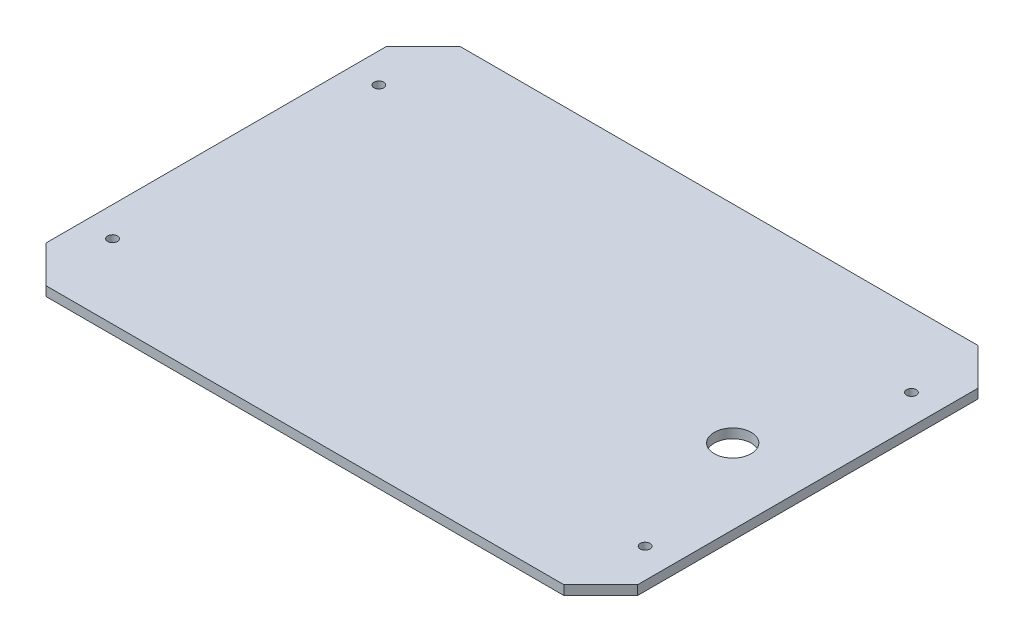
ISO-10303-21;
HEADER;
FILE_DESCRIPTION(('STEP AP214'),'2;1');
FILE_NAME('part.step','',(''),(''),'','','');
FILE_SCHEMA(('AUTOMOTIVE_DESIGN { 1 0 10303 214 1 1 1 1 }'));
ENDSEC;
DATA;
#1=APPLICATION_CONTEXT('core data for automotive mechanical design processes');
#2=APPLICATION_PROTOCOL_DEFINITION('international standard','automotive_design',2000,#1);
#3=PRODUCT_CONTEXT('',#1,'mechanical');
#4=PRODUCT('Part','Part','',(#3));
#5=PRODUCT_RELATED_PRODUCT_CATEGORY('part','',(#4));
#6=PRODUCT_DEFINITION_FORMATION('','',#4);
#7=PRODUCT_DEFINITION_CONTEXT('part definition',#1,'design');
#8=PRODUCT_DEFINITION('design','',#6,#7);
#9=PRODUCT_DEFINITION_SHAPE('','',#8);
#10=(LENGTH_UNIT() NAMED_UNIT(*) SI_UNIT(.MILLI.,.METRE.));
#11=(NAMED_UNIT(*) PLANE_ANGLE_UNIT() SI_UNIT($,.RADIAN.));
#12=(NAMED_UNIT(*) SI_UNIT($,.STERADIAN.) SOLID_ANGLE_UNIT());
#13=UNCERTAINTY_MEASURE_WITH_UNIT(LENGTH_MEASURE(1.E-05),#10,'distance_accuracy_value','');
#14=(GEOMETRIC_REPRESENTATION_CONTEXT(3) GLOBAL_UNCERTAINTY_ASSIGNED_CONTEXT((#13)) GLOBAL_UNIT_ASSIGNED_CONTEXT((#10,
#11,#12)) REPRESENTATION_CONTEXT('',''));
#15=CARTESIAN_POINT('',(0.,0.,0.));
#16=DIRECTION('',(0.,0.,1.));
#17=DIRECTION('',(1.,0.,0.));
#18=AXIS2_PLACEMENT_3D('',#15,#16,#17);
#19=CARTESIAN_POINT('',(0.,6.35,0.));
#20=DIRECTION('',(0.,-1.,0.));
#21=DIRECTION('',(0.,0.,-1.));
#22=AXIS2_PLACEMENT_3D('',#19,#20,#21);
#23=PLANE('',#22);
#24=CARTESIAN_POINT('',(380.,6.35,-230.));
#25=DIRECTION('',(0.,1.,0.));
#26=DIRECTION('',(0.,0.,1.));
#27=AXIS2_PLACEMENT_3D('',#24,#25,#26);
#28=CIRCLE('',#27,3.29999999999997);
#29=CARTESIAN_POINT('',(380.,6.35,-226.7));
#30=VERTEX_POINT('',#29);
#31=EDGE_CURVE('E202',#30,#30,#28,.T.);
#32=ORIENTED_EDGE('',*,*,#31,.F.);
#33=EDGE_LOOP('',(#32));
#34=FACE_BOUND('',#33,.T.);
#35=CARTESIAN_POINT('',(380.,6.35,-50.));
#36=DIRECTION('',(0.,1.,0.));
#37=DIRECTION('',(0.,0.,1.));
#38=AXIS2_PLACEMENT_3D('',#35,#36,#37);
#39=CIRCLE('',#38,3.29999999999997);
#40=CARTESIAN_POINT('',(380.,6.35,-46.7));
#41=VERTEX_POINT('',#40);
#42=EDGE_CURVE('E196',#41,#41,#39,.T.);
#43=ORIENTED_EDGE('',*,*,#42,.F.);
#44=EDGE_LOOP('',(#43));
#45=FACE_BOUND('',#44,.T.);
#46=CARTESIAN_POINT('',(20.,6.35,-230.));
#47=DIRECTION('',(0.,1.,0.));
#48=DIRECTION('',(0.,0.,1.));
#49=AXIS2_PLACEMENT_3D('',#46,#47,#48);
#50=CIRCLE('',#49,3.3);
#51=CARTESIAN_POINT('',(20.,6.35,-226.7));
#52=VERTEX_POINT('',#51);
#53=EDGE_CURVE('E184',#52,#52,#50,.T.);
#54=ORIENTED_EDGE('',*,*,#53,.F.);
#55=EDGE_LOOP('',(#54));
#56=FACE_BOUND('',#55,.T.);
#57=CARTESIAN_POINT('',(349.2,6.35,-140.));
#58=DIRECTION('',(0.,1.,0.));
#59=DIRECTION('',(0.,0.,1.));
#60=AXIS2_PLACEMENT_3D('',#57,#58,#59);
#61=CIRCLE('',#60,12.5);
#62=CARTESIAN_POINT('',(349.2,6.35,-127.5));
#63=VERTEX_POINT('',#62);
#64=EDGE_CURVE('E176',#63,#63,#61,.T.);
#65=ORIENTED_EDGE('',*,*,#64,.F.);
#66=EDGE_LOOP('',(#65));
#67=FACE_BOUND('',#66,.T.);
#68=DIRECTION('',(0.,0.,1.));
#69=VECTOR('',#68,1.);
#70=CARTESIAN_POINT('',(0.,6.35,0.));
#71=LINE('',#70,#69);
#72=CARTESIAN_POINT('',(0.,6.35,-255.));
#73=VERTEX_POINT('',#72);
#74=CARTESIAN_POINT('',(0.,6.35,-25.0000000000002));
#75=VERTEX_POINT('',#74);
#76=EDGE_CURVE('E136',#73,#75,#71,.T.);
#77=ORIENTED_EDGE('',*,*,#76,.T.);
#78=DIRECTION('',(-0.707106781186546,0.,-0.707106781186549));
#79=VECTOR('',#78,1.);
#80=CARTESIAN_POINT('',(25.0000000000001,6.35,0.));
#81=LINE('',#80,#79);
#82=CARTESIAN_POINT('',(25.0000000000001,6.35,0.));
#83=VERTEX_POINT('',#82);
#84=EDGE_CURVE('E151',#75,#83,#81,.F.);
#85=ORIENTED_EDGE('',*,*,#84,.T.);
#86=DIRECTION('',(1.,0.,0.));
#87=VECTOR('',#86,1.);
#88=CARTESIAN_POINT('',(0.,6.35,0.));
#89=LINE('',#88,#87);
#90=CARTESIAN_POINT('',(375.,6.35,0.));
#91=VERTEX_POINT('',#90);
#92=EDGE_CURVE('E119',#83,#91,#89,.T.);
#93=ORIENTED_EDGE('',*,*,#92,.T.);
#94=DIRECTION('',(-0.707106781186549,0.,0.707106781186546));
#95=VECTOR('',#94,1.);
#96=CARTESIAN_POINT('',(400.,6.35,-25.0000000000001));
#97=LINE('',#96,#95);
#98=CARTESIAN_POINT('',(400.,6.35,-25.0000000000001));
#99=VERTEX_POINT('',#98);
#100=EDGE_CURVE('E146',#91,#99,#97,.F.);
#101=ORIENTED_EDGE('',*,*,#100,.T.);
#102=DIRECTION('',(0.,0.,-1.));
#103=VECTOR('',#102,1.);
#104=CARTESIAN_POINT('',(400.,6.35,0.));
#105=LINE('',#104,#103);
#106=CARTESIAN_POINT('',(400.,6.35,-255.));
#107=VERTEX_POINT('',#106);
#108=EDGE_CURVE('E162',#99,#107,#105,.T.);
#109=ORIENTED_EDGE('',*,*,#108,.T.);
#110=DIRECTION('',(0.707106781186546,0.,0.707106781186549));
#111=VECTOR('',#110,1.);
#112=CARTESIAN_POINT('',(375.,6.35,-280.));
#113=LINE('',#112,#111);
#114=CARTESIAN_POINT('',(375.,6.35,-280.));
#115=VERTEX_POINT('',#114);
#116=EDGE_CURVE('E55',#107,#115,#113,.F.);
#117=ORIENTED_EDGE('',*,*,#116,.T.);
#118=DIRECTION('',(-1.,0.,0.));
#119=VECTOR('',#118,1.);
#120=CARTESIAN_POINT('',(0.,6.35,-280.));
#121=LINE('',#120,#119);
#122=CARTESIAN_POINT('',(25.,6.35,-280.));
#123=VERTEX_POINT('',#122);
#124=EDGE_CURVE('E137',#115,#123,#121,.T.);
#125=ORIENTED_EDGE('',*,*,#124,.T.);
#126=DIRECTION('',(0.707106781186548,0.,-0.707106781186547));
#127=VECTOR('',#126,1.);
#128=CARTESIAN_POINT('',(0.,6.35,-255.));
#129=LINE('',#128,#127);
#130=EDGE_CURVE('E149',#123,#73,#129,.F.);
#131=ORIENTED_EDGE('',*,*,#130,.T.);
#132=EDGE_LOOP('',(#77,#85,#93,#101,#109,#117,#125,#131));
#133=FACE_BOUND('',#132,.T.);
#134=CARTESIAN_POINT('',(20.,6.35,-50.));
#135=DIRECTION('',(0.,1.,0.));
#136=DIRECTION('',(0.,0.,1.));
#137=AXIS2_PLACEMENT_3D('',#134,#135,#136);
#138=CIRCLE('',#137,3.3);
#139=CARTESIAN_POINT('',(20.,6.35,-46.7));
#140=VERTEX_POINT('',#139);
#141=EDGE_CURVE('E190',#140,#140,#138,.T.);
#142=ORIENTED_EDGE('',*,*,#141,.F.);
#143=EDGE_LOOP('',(#142));
#144=FACE_BOUND('',#143,.T.);
#145=ADVANCED_FACE('F33',(#34,#45,#56,#67,#133,#144),#23,.F.);
#146=CARTESIAN_POINT('',(0.,6.35,0.));
#147=DIRECTION('',(1.,0.,0.));
#148=DIRECTION('',(0.,0.,-1.));
#149=AXIS2_PLACEMENT_3D('',#146,#147,#148);
#150=PLANE('',#149);
#151=DIRECTION('',(0.,0.,1.));
#152=VECTOR('',#151,1.);
#153=CARTESIAN_POINT('',(0.,0.,0.));
#154=LINE('',#153,#152);
#155=CARTESIAN_POINT('',(0.,0.,-255.));
#156=VERTEX_POINT('',#155);
#157=CARTESIAN_POINT('',(0.,0.,-25.0000000000002));
#158=VERTEX_POINT('',#157);
#159=EDGE_CURVE('E126',#156,#158,#154,.T.);
#160=ORIENTED_EDGE('',*,*,#159,.T.);
#161=DIRECTION('',(0.,1.,0.));
#162=VECTOR('',#161,1.);
#163=CARTESIAN_POINT('',(0.,6.35,-25.0000000000002));
#164=LINE('',#163,#162);
#165=EDGE_CURVE('E104',#158,#75,#164,.T.);
#166=ORIENTED_EDGE('',*,*,#165,.T.);
#167=ORIENTED_EDGE('',*,*,#76,.F.);
#168=DIRECTION('',(0.,-1.,0.));
#169=VECTOR('',#168,1.);
#170=CARTESIAN_POINT('',(0.,6.35,-255.));
#171=LINE('',#170,#169);
#172=EDGE_CURVE('E109',#73,#156,#171,.T.);
#173=ORIENTED_EDGE('',*,*,#172,.T.);
#174=EDGE_LOOP('',(#160,#166,#167,#173));
#175=FACE_BOUND('',#174,.T.);
#176=ADVANCED_FACE('F210',(#175),#150,.F.);
#177=CARTESIAN_POINT('',(0.,6.35,0.));
#178=DIRECTION('',(0.,0.,-1.));
#179=DIRECTION('',(-1.,0.,0.));
#180=AXIS2_PLACEMENT_3D('',#177,#178,#179);
#181=PLANE('',#180);
#182=ORIENTED_EDGE('',*,*,#92,.F.);
#183=DIRECTION('',(0.,-1.,0.));
#184=VECTOR('',#183,1.);
#185=CARTESIAN_POINT('',(25.0000000000001,6.35,0.));
#186=LINE('',#185,#184);
#187=CARTESIAN_POINT('',(25.0000000000001,0.,0.));
#188=VERTEX_POINT('',#187);
#189=EDGE_CURVE('E103',#83,#188,#186,.T.);
#190=ORIENTED_EDGE('',*,*,#189,.T.);
#191=DIRECTION('',(1.,0.,0.));
#192=VECTOR('',#191,1.);
#193=CARTESIAN_POINT('',(0.,0.,0.));
#194=LINE('',#193,#192);
#195=CARTESIAN_POINT('',(375.,0.,0.));
#196=VERTEX_POINT('',#195);
#197=EDGE_CURVE('E116',#188,#196,#194,.T.);
#198=ORIENTED_EDGE('',*,*,#197,.T.);
#199=DIRECTION('',(0.,1.,0.));
#200=VECTOR('',#199,1.);
#201=CARTESIAN_POINT('',(375.,6.35,0.));
#202=LINE('',#201,#200);
#203=EDGE_CURVE('E121',#196,#91,#202,.T.);
#204=ORIENTED_EDGE('',*,*,#203,.T.);
#205=EDGE_LOOP('',(#182,#190,#198,#204));
#206=FACE_BOUND('',#205,.T.);
#207=ADVANCED_FACE('F115',(#206),#181,.F.);
#208=CARTESIAN_POINT('',(400.,6.35,0.));
#209=DIRECTION('',(-1.,0.,0.));
#210=DIRECTION('',(0.,0.,1.));
#211=AXIS2_PLACEMENT_3D('',#208,#209,#210);
#212=PLANE('',#211);
#213=DIRECTION('',(0.,0.,-1.));
#214=VECTOR('',#213,1.);
#215=CARTESIAN_POINT('',(400.,0.,0.));
#216=LINE('',#215,#214);
#217=CARTESIAN_POINT('',(400.,0.,-25.0000000000001));
#218=VERTEX_POINT('',#217);
#219=CARTESIAN_POINT('',(400.,0.,-255.));
#220=VERTEX_POINT('',#219);
#221=EDGE_CURVE('E125',#218,#220,#216,.T.);
#222=ORIENTED_EDGE('',*,*,#221,.T.);
#223=DIRECTION('',(0.,1.,0.));
#224=VECTOR('',#223,1.);
#225=CARTESIAN_POINT('',(400.,6.35,-255.));
#226=LINE('',#225,#224);
#227=EDGE_CURVE('E11',#220,#107,#226,.T.);
#228=ORIENTED_EDGE('',*,*,#227,.T.);
#229=ORIENTED_EDGE('',*,*,#108,.F.);
#230=DIRECTION('',(0.,-1.,0.));
#231=VECTOR('',#230,1.);
#232=CARTESIAN_POINT('',(400.,6.35,-25.0000000000001));
#233=LINE('',#232,#231);
#234=EDGE_CURVE('E41',#99,#218,#233,.T.);
#235=ORIENTED_EDGE('',*,*,#234,.T.);
#236=EDGE_LOOP('',(#222,#228,#229,#235));
#237=FACE_BOUND('',#236,.T.);
#238=ADVANCED_FACE('F160',(#237),#212,.F.);
#239=CARTESIAN_POINT('',(0.,6.35,-280.));
#240=DIRECTION('',(0.,0.,1.));
#241=DIRECTION('',(1.,0.,0.));
#242=AXIS2_PLACEMENT_3D('',#239,#240,#241);
#243=PLANE('',#242);
#244=DIRECTION('',(-1.,0.,0.));
#245=VECTOR('',#244,1.);
#246=CARTESIAN_POINT('',(0.,0.,-280.));
#247=LINE('',#246,#245);
#248=CARTESIAN_POINT('',(375.,0.,-280.));
#249=VERTEX_POINT('',#248);
#250=CARTESIAN_POINT('',(25.,0.,-280.));
#251=VERTEX_POINT('',#250);
#252=EDGE_CURVE('E129',#249,#251,#247,.T.);
#253=ORIENTED_EDGE('',*,*,#252,.T.);
#254=DIRECTION('',(0.,1.,0.));
#255=VECTOR('',#254,1.);
#256=CARTESIAN_POINT('',(25.,6.35,-280.));
#257=LINE('',#256,#255);
#258=EDGE_CURVE('E48',#251,#123,#257,.T.);
#259=ORIENTED_EDGE('',*,*,#258,.T.);
#260=ORIENTED_EDGE('',*,*,#124,.F.);
#261=DIRECTION('',(0.,-1.,0.));
#262=VECTOR('',#261,1.);
#263=CARTESIAN_POINT('',(375.,6.35,-280.));
#264=LINE('',#263,#262);
#265=EDGE_CURVE('E153',#115,#249,#264,.T.);
#266=ORIENTED_EDGE('',*,*,#265,.T.);
#267=EDGE_LOOP('',(#253,#259,#260,#266));
#268=FACE_BOUND('',#267,.T.);
#269=ADVANCED_FACE('F169',(#268),#243,.F.);
#270=CARTESIAN_POINT('',(0.,0.,0.));
#271=DIRECTION('',(0.,-1.,0.));
#272=DIRECTION('',(0.,0.,-1.));
#273=AXIS2_PLACEMENT_3D('',#270,#271,#272);
#274=PLANE('',#273);
#275=CARTESIAN_POINT('',(380.,0.,-230.));
#276=DIRECTION('',(0.,1.,0.));
#277=DIRECTION('',(0.,0.,1.));
#278=AXIS2_PLACEMENT_3D('',#275,#276,#277);
#279=CIRCLE('',#278,3.29999999999997);
#280=CARTESIAN_POINT('',(380.,0.,-226.7));
#281=VERTEX_POINT('',#280);
#282=EDGE_CURVE('E199',#281,#281,#279,.T.);
#283=ORIENTED_EDGE('',*,*,#282,.T.);
#284=EDGE_LOOP('',(#283));
#285=FACE_BOUND('',#284,.T.);
#286=CARTESIAN_POINT('',(380.,0.,-50.));
#287=DIRECTION('',(0.,1.,0.));
#288=DIRECTION('',(0.,0.,1.));
#289=AXIS2_PLACEMENT_3D('',#286,#287,#288);
#290=CIRCLE('',#289,3.29999999999997);
#291=CARTESIAN_POINT('',(380.,0.,-46.7));
#292=VERTEX_POINT('',#291);
#293=EDGE_CURVE('E193',#292,#292,#290,.T.);
#294=ORIENTED_EDGE('',*,*,#293,.T.);
#295=EDGE_LOOP('',(#294));
#296=FACE_BOUND('',#295,.T.);
#297=CARTESIAN_POINT('',(20.,0.,-50.));
#298=DIRECTION('',(0.,1.,0.));
#299=DIRECTION('',(0.,0.,1.));
#300=AXIS2_PLACEMENT_3D('',#297,#298,#299);
#301=CIRCLE('',#300,3.29999999999999);
#302=CARTESIAN_POINT('',(20.,0.,-46.7));
#303=VERTEX_POINT('',#302);
#304=EDGE_CURVE('E187',#303,#303,#301,.T.);
#305=ORIENTED_EDGE('',*,*,#304,.T.);
#306=EDGE_LOOP('',(#305));
#307=FACE_BOUND('',#306,.T.);
#308=CARTESIAN_POINT('',(20.,0.,-230.));
#309=DIRECTION('',(0.,1.,0.));
#310=DIRECTION('',(0.,0.,1.));
#311=AXIS2_PLACEMENT_3D('',#308,#309,#310);
#312=CIRCLE('',#311,3.29999999999999);
#313=CARTESIAN_POINT('',(20.,0.,-226.7));
#314=VERTEX_POINT('',#313);
#315=EDGE_CURVE('E179',#314,#314,#312,.T.);
#316=ORIENTED_EDGE('',*,*,#315,.T.);
#317=EDGE_LOOP('',(#316));
#318=FACE_BOUND('',#317,.T.);
#319=CARTESIAN_POINT('',(349.2,0.,-140.));
#320=DIRECTION('',(0.,1.,0.));
#321=DIRECTION('',(0.,0.,1.));
#322=AXIS2_PLACEMENT_3D('',#319,#320,#321);
#323=CIRCLE('',#322,12.5);
#324=CARTESIAN_POINT('',(349.2,0.,-127.5));
#325=VERTEX_POINT('',#324);
#326=EDGE_CURVE('E131',#325,#325,#323,.T.);
#327=ORIENTED_EDGE('',*,*,#326,.T.);
#328=EDGE_LOOP('',(#327));
#329=FACE_BOUND('',#328,.T.);
#330=ORIENTED_EDGE('',*,*,#197,.F.);
#331=DIRECTION('',(0.707106781186546,0.,0.707106781186549));
#332=VECTOR('',#331,1.);
#333=CARTESIAN_POINT('',(12.5000000000001,0.,-12.5));
#334=LINE('',#333,#332);
#335=EDGE_CURVE('E99',#188,#158,#334,.F.);
#336=ORIENTED_EDGE('',*,*,#335,.T.);
#337=ORIENTED_EDGE('',*,*,#159,.F.);
#338=DIRECTION('',(-0.707106781186548,0.,0.707106781186547));
#339=VECTOR('',#338,1.);
#340=CARTESIAN_POINT('',(-127.5,0.,-127.5));
#341=LINE('',#340,#339);
#342=EDGE_CURVE('E110',#156,#251,#341,.F.);
#343=ORIENTED_EDGE('',*,*,#342,.T.);
#344=ORIENTED_EDGE('',*,*,#252,.F.);
#345=DIRECTION('',(-0.707106781186546,0.,-0.707106781186549));
#346=VECTOR('',#345,1.);
#347=CARTESIAN_POINT('',(327.500000000001,0.,-327.499999999999));
#348=LINE('',#347,#346);
#349=EDGE_CURVE('E140',#249,#220,#348,.F.);
#350=ORIENTED_EDGE('',*,*,#349,.T.);
#351=ORIENTED_EDGE('',*,*,#221,.F.);
#352=DIRECTION('',(0.707106781186549,0.,-0.707106781186546));
#353=VECTOR('',#352,1.);
#354=CARTESIAN_POINT('',(187.499999999999,0.,187.5));
#355=LINE('',#354,#353);
#356=EDGE_CURVE('E120',#218,#196,#355,.F.);
#357=ORIENTED_EDGE('',*,*,#356,.T.);
#358=EDGE_LOOP('',(#330,#336,#337,#343,#344,#350,#351,#357));
#359=FACE_BOUND('',#358,.T.);
#360=ADVANCED_FACE('F123',(#285,#296,#307,#318,#329,#359),#274,.T.);
#361=CARTESIAN_POINT('',(25.0000000000001,6.35,0.));
#362=DIRECTION('',(0.707106781186549,0.,-0.707106781186546));
#363=DIRECTION('',(0.,-1.,0.));
#364=AXIS2_PLACEMENT_3D('',#361,#362,#363);
#365=PLANE('',#364);
#366=ORIENTED_EDGE('',*,*,#84,.F.);
#367=ORIENTED_EDGE('',*,*,#165,.F.);
#368=ORIENTED_EDGE('',*,*,#335,.F.);
#369=ORIENTED_EDGE('',*,*,#189,.F.);
#370=EDGE_LOOP('',(#366,#367,#368,#369));
#371=FACE_BOUND('',#370,.T.);
#372=ADVANCED_FACE('F102',(#371),#365,.F.);
#373=CARTESIAN_POINT('',(0.,6.35,-255.));
#374=DIRECTION('',(0.707106781186547,0.,0.707106781186548));
#375=DIRECTION('',(0.,-1.,0.));
#376=AXIS2_PLACEMENT_3D('',#373,#374,#375);
#377=PLANE('',#376);
#378=ORIENTED_EDGE('',*,*,#130,.F.);
#379=ORIENTED_EDGE('',*,*,#258,.F.);
#380=ORIENTED_EDGE('',*,*,#342,.F.);
#381=ORIENTED_EDGE('',*,*,#172,.F.);
#382=EDGE_LOOP('',(#378,#379,#380,#381));
#383=FACE_BOUND('',#382,.T.);
#384=ADVANCED_FACE('F256',(#383),#377,.F.);
#385=CARTESIAN_POINT('',(375.,6.35,-280.));
#386=DIRECTION('',(-0.707106781186549,0.,0.707106781186546));
#387=DIRECTION('',(0.,-1.,0.));
#388=AXIS2_PLACEMENT_3D('',#385,#386,#387);
#389=PLANE('',#388);
#390=ORIENTED_EDGE('',*,*,#116,.F.);
#391=ORIENTED_EDGE('',*,*,#227,.F.);
#392=ORIENTED_EDGE('',*,*,#349,.F.);
#393=ORIENTED_EDGE('',*,*,#265,.F.);
#394=EDGE_LOOP('',(#390,#391,#392,#393));
#395=FACE_BOUND('',#394,.T.);
#396=ADVANCED_FACE('F168',(#395),#389,.F.);
#397=CARTESIAN_POINT('',(400.,6.35,-25.0000000000001));
#398=DIRECTION('',(-0.707106781186546,0.,-0.707106781186549));
#399=DIRECTION('',(0.,-1.,0.));
#400=AXIS2_PLACEMENT_3D('',#397,#398,#399);
#401=PLANE('',#400);
#402=ORIENTED_EDGE('',*,*,#100,.F.);
#403=ORIENTED_EDGE('',*,*,#203,.F.);
#404=ORIENTED_EDGE('',*,*,#356,.F.);
#405=ORIENTED_EDGE('',*,*,#234,.F.);
#406=EDGE_LOOP('',(#402,#403,#404,#405));
#407=FACE_BOUND('',#406,.T.);
#408=ADVANCED_FACE('F35',(#407),#401,.F.);
#409=CARTESIAN_POINT('',(349.2,0.,-140.));
#410=DIRECTION('',(0.,1.,0.));
#411=DIRECTION('',(0.,0.,1.));
#412=AXIS2_PLACEMENT_3D('',#409,#410,#411);
#413=CYLINDRICAL_SURFACE('',#412,12.5);
#414=ORIENTED_EDGE('',*,*,#326,.F.);
#415=EDGE_LOOP('',(#414));
#416=FACE_BOUND('',#415,.T.);
#417=ORIENTED_EDGE('',*,*,#64,.T.);
#418=EDGE_LOOP('',(#417));
#419=FACE_BOUND('',#418,.T.);
#420=ADVANCED_FACE('F233',(#416,#419),#413,.F.);
#421=CARTESIAN_POINT('',(20.,6.35,-230.));
#422=DIRECTION('',(0.,1.,0.));
#423=DIRECTION('',(0.,0.,1.));
#424=AXIS2_PLACEMENT_3D('',#421,#422,#423);
#425=CYLINDRICAL_SURFACE('',#424,3.3);
#426=ORIENTED_EDGE('',*,*,#315,.F.);
#427=EDGE_LOOP('',(#426));
#428=FACE_BOUND('',#427,.T.);
#429=ORIENTED_EDGE('',*,*,#53,.T.);
#430=EDGE_LOOP('',(#429));
#431=FACE_BOUND('',#430,.T.);
#432=ADVANCED_FACE('F224',(#428,#431),#425,.F.);
#433=CARTESIAN_POINT('',(20.,6.35,-50.));
#434=DIRECTION('',(0.,1.,0.));
#435=DIRECTION('',(0.,0.,1.));
#436=AXIS2_PLACEMENT_3D('',#433,#434,#435);
#437=CYLINDRICAL_SURFACE('',#436,3.3);
#438=ORIENTED_EDGE('',*,*,#304,.F.);
#439=EDGE_LOOP('',(#438));
#440=FACE_BOUND('',#439,.T.);
#441=ORIENTED_EDGE('',*,*,#141,.T.);
#442=EDGE_LOOP('',(#441));
#443=FACE_BOUND('',#442,.T.);
#444=ADVANCED_FACE('F221',(#440,#443),#437,.F.);
#445=CARTESIAN_POINT('',(380.,6.35,-50.));
#446=DIRECTION('',(0.,1.,0.));
#447=DIRECTION('',(0.,0.,1.));
#448=AXIS2_PLACEMENT_3D('',#445,#446,#447);
#449=CYLINDRICAL_SURFACE('',#448,3.29999999999997);
#450=ORIENTED_EDGE('',*,*,#293,.F.);
#451=EDGE_LOOP('',(#450));
#452=FACE_BOUND('',#451,.T.);
#453=ORIENTED_EDGE('',*,*,#42,.T.);
#454=EDGE_LOOP('',(#453));
#455=FACE_BOUND('',#454,.T.);
#456=ADVANCED_FACE('F223',(#452,#455),#449,.F.);
#457=CARTESIAN_POINT('',(380.,6.35,-230.));
#458=DIRECTION('',(0.,1.,0.));
#459=DIRECTION('',(0.,0.,1.));
#460=AXIS2_PLACEMENT_3D('',#457,#458,#459);
#461=CYLINDRICAL_SURFACE('',#460,3.29999999999997);
#462=ORIENTED_EDGE('',*,*,#282,.F.);
#463=EDGE_LOOP('',(#462));
#464=FACE_BOUND('',#463,.T.);
#465=ORIENTED_EDGE('',*,*,#31,.T.);
#466=EDGE_LOOP('',(#465));
#467=FACE_BOUND('',#466,.T.);
#468=ADVANCED_FACE('F206',(#464,#467),#461,.F.);
#469=CLOSED_SHELL('',(#145,#176,#207,#238,#269,#360,#372,#384,#396,#408,#420,#432,#444,#456,#468));
#470=MANIFOLD_SOLID_BREP('B2',#469);
#471=ADVANCED_BREP_SHAPE_REPRESENTATION('',(#18,#470),#14);
#472=SHAPE_DEFINITION_REPRESENTATION(#9,#471);
ENDSEC;
END-ISO-10303-21;
